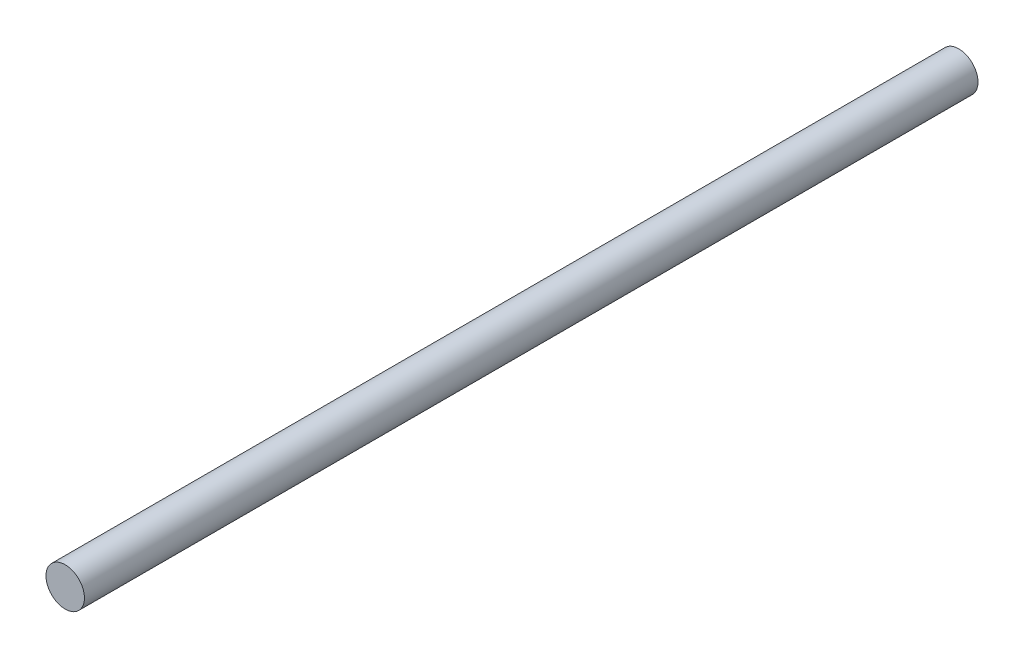
ISO-10303-21;
HEADER;
FILE_DESCRIPTION(('STEP AP214'),'2;1');
FILE_NAME('part.step','',(''),(''),'','','');
FILE_SCHEMA(('AUTOMOTIVE_DESIGN { 1 0 10303 214 1 1 1 1 }'));
ENDSEC;
DATA;
#1=APPLICATION_CONTEXT('core data for automotive mechanical design processes');
#2=APPLICATION_PROTOCOL_DEFINITION('international standard','automotive_design',2000,#1);
#3=PRODUCT_CONTEXT('',#1,'mechanical');
#4=PRODUCT('Part','Part','',(#3));
#5=PRODUCT_RELATED_PRODUCT_CATEGORY('part','',(#4));
#6=PRODUCT_DEFINITION_FORMATION('','',#4);
#7=PRODUCT_DEFINITION_CONTEXT('part definition',#1,'design');
#8=PRODUCT_DEFINITION('design','',#6,#7);
#9=PRODUCT_DEFINITION_SHAPE('','',#8);
#10=(LENGTH_UNIT() NAMED_UNIT(*) SI_UNIT(.MILLI.,.METRE.));
#11=(NAMED_UNIT(*) PLANE_ANGLE_UNIT() SI_UNIT($,.RADIAN.));
#12=(NAMED_UNIT(*) SI_UNIT($,.STERADIAN.) SOLID_ANGLE_UNIT());
#13=UNCERTAINTY_MEASURE_WITH_UNIT(LENGTH_MEASURE(1.E-05),#10,'distance_accuracy_value','');
#14=(GEOMETRIC_REPRESENTATION_CONTEXT(3) GLOBAL_UNCERTAINTY_ASSIGNED_CONTEXT((#13)) GLOBAL_UNIT_ASSIGNED_CONTEXT((#10,
#11,#12)) REPRESENTATION_CONTEXT('',''));
#15=CARTESIAN_POINT('',(0.,0.,0.));
#16=DIRECTION('',(0.,0.,1.));
#17=DIRECTION('',(1.,0.,0.));
#18=AXIS2_PLACEMENT_3D('',#15,#16,#17);
#19=CARTESIAN_POINT('',(0.,0.,70.));
#20=DIRECTION('',(0.,0.,1.));
#21=DIRECTION('',(1.,0.,0.));
#22=AXIS2_PLACEMENT_3D('',#19,#20,#21);
#23=PLANE('',#22);
#24=CARTESIAN_POINT('',(0.,0.,70.));
#25=DIRECTION('',(0.,0.,1.));
#26=DIRECTION('',(1.,0.,0.));
#27=AXIS2_PLACEMENT_3D('',#24,#25,#26);
#28=CIRCLE('',#27,55.);
#29=CARTESIAN_POINT('',(55.,0.,70.));
#30=VERTEX_POINT('',#29);
#31=EDGE_CURVE('E10',#30,#30,#28,.T.);
#32=ORIENTED_EDGE('',*,*,#31,.F.);
#33=EDGE_LOOP('',(#32));
#34=FACE_BOUND('',#33,.T.);
#35=CARTESIAN_POINT('',(0.,0.,70.));
#36=DIRECTION('',(0.,0.,1.));
#37=DIRECTION('',(1.,0.,0.));
#38=AXIS2_PLACEMENT_3D('',#35,#36,#37);
#39=CIRCLE('',#38,53.);
#40=CARTESIAN_POINT('',(53.,0.,70.));
#41=VERTEX_POINT('',#40);
#42=EDGE_CURVE('E40',#41,#41,#39,.T.);
#43=ORIENTED_EDGE('',*,*,#42,.T.);
#44=EDGE_LOOP('',(#43));
#45=FACE_BOUND('',#44,.T.);
#46=ADVANCED_FACE('F33',(#34,#45),#23,.F.);
#47=CARTESIAN_POINT('',(0.,0.,2570.));
#48=DIRECTION('',(0.,0.,-1.));
#49=DIRECTION('',(-1.,0.,0.));
#50=AXIS2_PLACEMENT_3D('',#47,#48,#49);
#51=CYLINDRICAL_SURFACE('',#50,55.);
#52=ORIENTED_EDGE('',*,*,#31,.T.);
#53=EDGE_LOOP('',(#52));
#54=FACE_BOUND('',#53,.T.);
#55=CARTESIAN_POINT('',(0.,0.,2625.));
#56=DIRECTION('',(0.,0.,1.));
#57=DIRECTION('',(1.,0.,0.));
#58=AXIS2_PLACEMENT_3D('',#55,#56,#57);
#59=CIRCLE('',#58,55.);
#60=CARTESIAN_POINT('',(55.,0.,2625.));
#61=VERTEX_POINT('',#60);
#62=EDGE_CURVE('E48',#61,#61,#59,.T.);
#63=ORIENTED_EDGE('',*,*,#62,.F.);
#64=EDGE_LOOP('',(#63));
#65=FACE_BOUND('',#64,.T.);
#66=ADVANCED_FACE('F35',(#54,#65),#51,.T.);
#67=CARTESIAN_POINT('',(0.,0.,2570.));
#68=DIRECTION('',(0.,0.,-1.));
#69=DIRECTION('',(-1.,0.,0.));
#70=AXIS2_PLACEMENT_3D('',#67,#68,#69);
#71=CYLINDRICAL_SURFACE('',#70,53.);
#72=CARTESIAN_POINT('',(0.,0.,2570.));
#73=DIRECTION('',(0.,0.,1.));
#74=DIRECTION('',(1.,0.,0.));
#75=AXIS2_PLACEMENT_3D('',#72,#73,#74);
#76=CIRCLE('',#75,53.);
#77=CARTESIAN_POINT('',(53.,0.,2570.));
#78=VERTEX_POINT('',#77);
#79=EDGE_CURVE('E44',#78,#78,#76,.T.);
#80=ORIENTED_EDGE('',*,*,#79,.T.);
#81=EDGE_LOOP('',(#80));
#82=FACE_BOUND('',#81,.T.);
#83=ORIENTED_EDGE('',*,*,#42,.F.);
#84=EDGE_LOOP('',(#83));
#85=FACE_BOUND('',#84,.T.);
#86=ADVANCED_FACE('F57',(#82,#85),#71,.F.);
#87=CARTESIAN_POINT('',(0.,0.,2570.));
#88=DIRECTION('',(0.,0.,1.));
#89=DIRECTION('',(1.,0.,0.));
#90=AXIS2_PLACEMENT_3D('',#87,#88,#89);
#91=PLANE('',#90);
#92=ORIENTED_EDGE('',*,*,#79,.F.);
#93=EDGE_LOOP('',(#92));
#94=FACE_BOUND('',#93,.T.);
#95=ADVANCED_FACE('F62',(#94),#91,.F.);
#96=CARTESIAN_POINT('',(0.,0.,2625.));
#97=DIRECTION('',(0.,0.,1.));
#98=DIRECTION('',(1.,0.,0.));
#99=AXIS2_PLACEMENT_3D('',#96,#97,#98);
#100=PLANE('',#99);
#101=ORIENTED_EDGE('',*,*,#62,.T.);
#102=EDGE_LOOP('',(#101));
#103=FACE_BOUND('',#102,.T.);
#104=ADVANCED_FACE('F54',(#103),#100,.T.);
#105=CLOSED_SHELL('',(#46,#66,#86,#95,#104));
#106=MANIFOLD_SOLID_BREP('B2',#105);
#107=ADVANCED_BREP_SHAPE_REPRESENTATION('',(#18,#106),#14);
#108=SHAPE_DEFINITION_REPRESENTATION(#9,#107);
ENDSEC;
END-ISO-10303-21;
